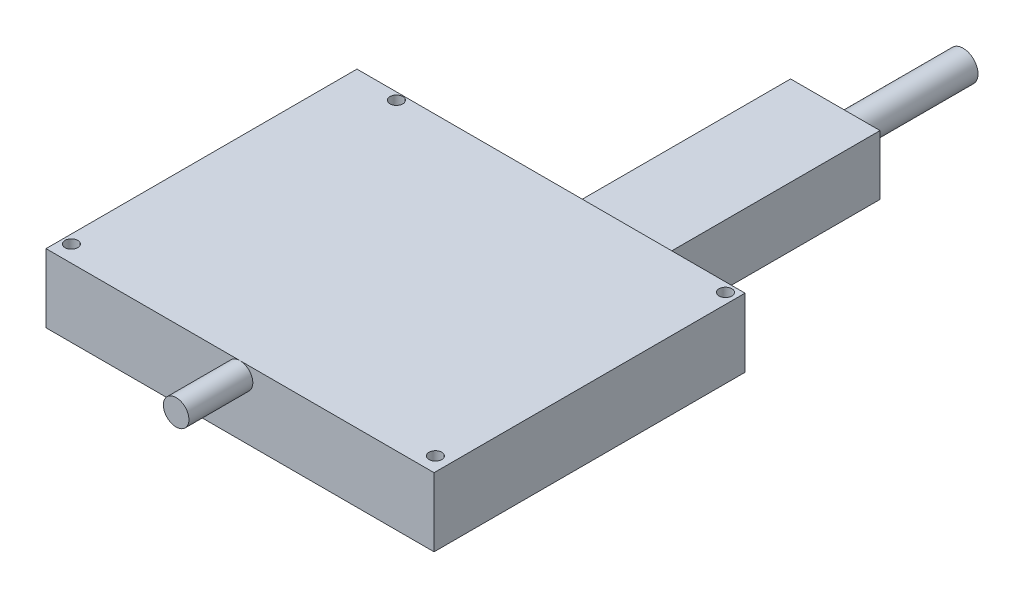
ISO-10303-21;
HEADER;
FILE_DESCRIPTION(('STEP AP214'),'2;1');
FILE_NAME('part.step','',(''),(''),'','','');
FILE_SCHEMA(('AUTOMOTIVE_DESIGN { 1 0 10303 214 1 1 1 1 }'));
ENDSEC;
DATA;
#1=APPLICATION_CONTEXT('core data for automotive mechanical design processes');
#2=APPLICATION_PROTOCOL_DEFINITION('international standard','automotive_design',2000,#1);
#3=PRODUCT_CONTEXT('',#1,'mechanical');
#4=PRODUCT('Part','Part','',(#3));
#5=PRODUCT_RELATED_PRODUCT_CATEGORY('part','',(#4));
#6=PRODUCT_DEFINITION_FORMATION('','',#4);
#7=PRODUCT_DEFINITION_CONTEXT('part definition',#1,'design');
#8=PRODUCT_DEFINITION('design','',#6,#7);
#9=PRODUCT_DEFINITION_SHAPE('','',#8);
#10=(LENGTH_UNIT() NAMED_UNIT(*) SI_UNIT(.MILLI.,.METRE.));
#11=(NAMED_UNIT(*) PLANE_ANGLE_UNIT() SI_UNIT($,.RADIAN.));
#12=(NAMED_UNIT(*) SI_UNIT($,.STERADIAN.) SOLID_ANGLE_UNIT());
#13=UNCERTAINTY_MEASURE_WITH_UNIT(LENGTH_MEASURE(1.E-05),#10,'distance_accuracy_value','');
#14=(GEOMETRIC_REPRESENTATION_CONTEXT(3) GLOBAL_UNCERTAINTY_ASSIGNED_CONTEXT((#13)) GLOBAL_UNIT_ASSIGNED_CONTEXT((#10,
#11,#12)) REPRESENTATION_CONTEXT('',''));
#15=CARTESIAN_POINT('',(0.,0.,0.));
#16=DIRECTION('',(0.,0.,1.));
#17=DIRECTION('',(1.,0.,0.));
#18=AXIS2_PLACEMENT_3D('',#15,#16,#17);
#19=CARTESIAN_POINT('',(0.,16.1,0.));
#20=DIRECTION('',(0.,1.,0.));
#21=DIRECTION('',(0.,0.,1.));
#22=AXIS2_PLACEMENT_3D('',#19,#20,#21);
#23=PLANE('',#22);
#24=CARTESIAN_POINT('',(42.3,16.1,32.93));
#25=DIRECTION('',(0.,1.,0.));
#26=DIRECTION('',(0.,0.,1.));
#27=AXIS2_PLACEMENT_3D('',#24,#25,#26);
#28=CIRCLE('',#27,1.5);
#29=CARTESIAN_POINT('',(42.3,16.1,34.43));
#30=VERTEX_POINT('',#29);
#31=EDGE_CURVE('E188',#30,#30,#28,.T.);
#32=ORIENTED_EDGE('',*,*,#31,.F.);
#33=EDGE_LOOP('',(#32));
#34=FACE_BOUND('',#33,.T.);
#35=CARTESIAN_POINT('',(-34.59,16.1,-34.8));
#36=DIRECTION('',(0.,1.,0.));
#37=DIRECTION('',(0.,0.,1.));
#38=AXIS2_PLACEMENT_3D('',#35,#36,#37);
#39=CIRCLE('',#38,1.5);
#40=CARTESIAN_POINT('',(-34.59,16.1,-33.3));
#41=VERTEX_POINT('',#40);
#42=EDGE_CURVE('E204',#41,#41,#39,.T.);
#43=ORIENTED_EDGE('',*,*,#42,.F.);
#44=EDGE_LOOP('',(#43));
#45=FACE_BOUND('',#44,.T.);
#46=DIRECTION('',(0.,0.,-1.));
#47=VECTOR('',#46,1.);
#48=CARTESIAN_POINT('',(45.55,16.1,-36.5));
#49=LINE('',#48,#47);
#50=CARTESIAN_POINT('',(45.55,16.1,36.5));
#51=VERTEX_POINT('',#50);
#52=CARTESIAN_POINT('',(45.55,16.1,-36.5));
#53=VERTEX_POINT('',#52);
#54=EDGE_CURVE('E212',#51,#53,#49,.T.);
#55=ORIENTED_EDGE('',*,*,#54,.T.);
#56=DIRECTION('',(-1.,0.,0.));
#57=VECTOR('',#56,1.);
#58=CARTESIAN_POINT('',(-45.55,16.1,-36.5));
#59=LINE('',#58,#57);
#60=CARTESIAN_POINT('',(-45.55,16.1,-36.5));
#61=VERTEX_POINT('',#60);
#62=EDGE_CURVE('E216',#53,#61,#59,.T.);
#63=ORIENTED_EDGE('',*,*,#62,.T.);
#64=DIRECTION('',(0.,0.,1.));
#65=VECTOR('',#64,1.);
#66=CARTESIAN_POINT('',(-45.55,16.1,-36.5));
#67=LINE('',#66,#65);
#68=CARTESIAN_POINT('',(-45.55,16.1,36.5));
#69=VERTEX_POINT('',#68);
#70=EDGE_CURVE('E220',#61,#69,#67,.T.);
#71=ORIENTED_EDGE('',*,*,#70,.T.);
#72=DIRECTION('',(1.,0.,0.));
#73=VECTOR('',#72,1.);
#74=CARTESIAN_POINT('',(-45.55,16.1,36.5));
#75=LINE('',#74,#73);
#76=CARTESIAN_POINT('',(0.,16.1,36.5));
#77=VERTEX_POINT('',#76);
#78=EDGE_CURVE('E224',#69,#77,#75,.T.);
#79=ORIENTED_EDGE('',*,*,#78,.T.);
#80=EDGE_CURVE('E223',#77,#51,#75,.T.);
#81=ORIENTED_EDGE('',*,*,#80,.T.);
#82=EDGE_LOOP('',(#55,#63,#71,#79,#81));
#83=FACE_BOUND('',#82,.T.);
#84=CARTESIAN_POINT('',(43.1,16.1,-34.36));
#85=DIRECTION('',(0.,1.,0.));
#86=DIRECTION('',(0.,0.,1.));
#87=AXIS2_PLACEMENT_3D('',#84,#85,#86);
#88=CIRCLE('',#87,1.5);
#89=CARTESIAN_POINT('',(43.1,16.1,-32.86));
#90=VERTEX_POINT('',#89);
#91=EDGE_CURVE('E196',#90,#90,#88,.T.);
#92=ORIENTED_EDGE('',*,*,#91,.F.);
#93=EDGE_LOOP('',(#92));
#94=FACE_BOUND('',#93,.T.);
#95=CARTESIAN_POINT('',(-43.5,16.1,32.58));
#96=DIRECTION('',(0.,1.,0.));
#97=DIRECTION('',(0.,0.,1.));
#98=AXIS2_PLACEMENT_3D('',#95,#96,#97);
#99=CIRCLE('',#98,1.5);
#100=CARTESIAN_POINT('',(-43.5,16.1,34.08));
#101=VERTEX_POINT('',#100);
#102=EDGE_CURVE('E180',#101,#101,#99,.T.);
#103=ORIENTED_EDGE('',*,*,#102,.F.);
#104=EDGE_LOOP('',(#103));
#105=FACE_BOUND('',#104,.T.);
#106=ADVANCED_FACE('F39',(#34,#45,#83,#94,#105),#23,.T.);
#107=CARTESIAN_POINT('',(0.,0.,0.));
#108=DIRECTION('',(0.,1.,0.));
#109=DIRECTION('',(0.,0.,1.));
#110=AXIS2_PLACEMENT_3D('',#107,#108,#109);
#111=PLANE('',#110);
#112=DIRECTION('',(0.,0.,-1.));
#113=VECTOR('',#112,1.);
#114=CARTESIAN_POINT('',(45.55,0.,-36.5));
#115=LINE('',#114,#113);
#116=CARTESIAN_POINT('',(45.55,0.,36.5));
#117=VERTEX_POINT('',#116);
#118=CARTESIAN_POINT('',(45.55,0.,-36.5));
#119=VERTEX_POINT('',#118);
#120=EDGE_CURVE('E208',#117,#119,#115,.T.);
#121=ORIENTED_EDGE('',*,*,#120,.F.);
#122=DIRECTION('',(1.,0.,0.));
#123=VECTOR('',#122,1.);
#124=CARTESIAN_POINT('',(-45.55,0.,36.5));
#125=LINE('',#124,#123);
#126=CARTESIAN_POINT('',(-45.55,0.,36.5));
#127=VERTEX_POINT('',#126);
#128=EDGE_CURVE('E217',#127,#117,#125,.T.);
#129=ORIENTED_EDGE('',*,*,#128,.F.);
#130=DIRECTION('',(0.,0.,1.));
#131=VECTOR('',#130,1.);
#132=CARTESIAN_POINT('',(-45.55,0.,-36.5));
#133=LINE('',#132,#131);
#134=CARTESIAN_POINT('',(-45.55,0.,-36.5));
#135=VERTEX_POINT('',#134);
#136=EDGE_CURVE('E235',#135,#127,#133,.T.);
#137=ORIENTED_EDGE('',*,*,#136,.F.);
#138=DIRECTION('',(-1.,0.,0.));
#139=VECTOR('',#138,1.);
#140=CARTESIAN_POINT('',(-45.55,0.,-36.5));
#141=LINE('',#140,#139);
#142=CARTESIAN_POINT('',(3.24999999999999,0.,-36.5));
#143=VERTEX_POINT('',#142);
#144=EDGE_CURVE('E231',#143,#135,#141,.T.);
#145=ORIENTED_EDGE('',*,*,#144,.F.);
#146=CARTESIAN_POINT('',(24.25,0.,-36.5));
#147=VERTEX_POINT('',#146);
#148=EDGE_CURVE('E236',#147,#143,#141,.T.);
#149=ORIENTED_EDGE('',*,*,#148,.F.);
#150=EDGE_CURVE('E232',#119,#147,#141,.T.);
#151=ORIENTED_EDGE('',*,*,#150,.F.);
#152=EDGE_LOOP('',(#121,#129,#137,#145,#149,#151));
#153=FACE_BOUND('',#152,.T.);
#154=CARTESIAN_POINT('',(-34.59,0.,-34.8));
#155=DIRECTION('',(0.,1.,0.));
#156=DIRECTION('',(0.,0.,1.));
#157=AXIS2_PLACEMENT_3D('',#154,#155,#156);
#158=CIRCLE('',#157,1.5);
#159=CARTESIAN_POINT('',(-34.59,0.,-33.3));
#160=VERTEX_POINT('',#159);
#161=EDGE_CURVE('E200',#160,#160,#158,.T.);
#162=ORIENTED_EDGE('',*,*,#161,.T.);
#163=EDGE_LOOP('',(#162));
#164=FACE_BOUND('',#163,.T.);
#165=CARTESIAN_POINT('',(43.1,0.,-34.36));
#166=DIRECTION('',(0.,1.,0.));
#167=DIRECTION('',(0.,0.,1.));
#168=AXIS2_PLACEMENT_3D('',#165,#166,#167);
#169=CIRCLE('',#168,1.5);
#170=CARTESIAN_POINT('',(43.1,0.,-32.86));
#171=VERTEX_POINT('',#170);
#172=EDGE_CURVE('E192',#171,#171,#169,.T.);
#173=ORIENTED_EDGE('',*,*,#172,.T.);
#174=EDGE_LOOP('',(#173));
#175=FACE_BOUND('',#174,.T.);
#176=CARTESIAN_POINT('',(42.3,0.,32.93));
#177=DIRECTION('',(0.,1.,0.));
#178=DIRECTION('',(0.,0.,1.));
#179=AXIS2_PLACEMENT_3D('',#176,#177,#178);
#180=CIRCLE('',#179,1.5);
#181=CARTESIAN_POINT('',(42.3,0.,34.43));
#182=VERTEX_POINT('',#181);
#183=EDGE_CURVE('E184',#182,#182,#180,.T.);
#184=ORIENTED_EDGE('',*,*,#183,.T.);
#185=EDGE_LOOP('',(#184));
#186=FACE_BOUND('',#185,.T.);
#187=CARTESIAN_POINT('',(-43.5,0.,32.58));
#188=DIRECTION('',(0.,1.,0.));
#189=DIRECTION('',(0.,0.,1.));
#190=AXIS2_PLACEMENT_3D('',#187,#188,#189);
#191=CIRCLE('',#190,1.5);
#192=CARTESIAN_POINT('',(-43.5,0.,34.08));
#193=VERTEX_POINT('',#192);
#194=EDGE_CURVE('E176',#193,#193,#191,.T.);
#195=ORIENTED_EDGE('',*,*,#194,.T.);
#196=EDGE_LOOP('',(#195));
#197=FACE_BOUND('',#196,.T.);
#198=ADVANCED_FACE('F263',(#153,#164,#175,#186,#197),#111,.F.);
#199=CARTESIAN_POINT('',(45.55,16.1,-36.5));
#200=DIRECTION('',(-1.,0.,0.));
#201=DIRECTION('',(0.,0.,1.));
#202=AXIS2_PLACEMENT_3D('',#199,#200,#201);
#203=PLANE('',#202);
#204=ORIENTED_EDGE('',*,*,#120,.T.);
#205=DIRECTION('',(0.,-1.,0.));
#206=VECTOR('',#205,1.);
#207=CARTESIAN_POINT('',(45.55,16.1,-36.5));
#208=LINE('',#207,#206);
#209=EDGE_CURVE('E43',#53,#119,#208,.T.);
#210=ORIENTED_EDGE('',*,*,#209,.F.);
#211=ORIENTED_EDGE('',*,*,#54,.F.);
#212=DIRECTION('',(0.,-1.,0.));
#213=VECTOR('',#212,1.);
#214=CARTESIAN_POINT('',(45.55,16.1,36.5));
#215=LINE('',#214,#213);
#216=EDGE_CURVE('E227',#51,#117,#215,.T.);
#217=ORIENTED_EDGE('',*,*,#216,.T.);
#218=EDGE_LOOP('',(#204,#210,#211,#217));
#219=FACE_BOUND('',#218,.T.);
#220=ADVANCED_FACE('F41',(#219),#203,.F.);
#221=CARTESIAN_POINT('',(-45.55,16.1,-36.5));
#222=DIRECTION('',(0.,0.,1.));
#223=DIRECTION('',(1.,0.,0.));
#224=AXIS2_PLACEMENT_3D('',#221,#222,#223);
#225=PLANE('',#224);
#226=ORIENTED_EDGE('',*,*,#150,.T.);
#227=DIRECTION('',(0.,1.,0.));
#228=VECTOR('',#227,1.);
#229=CARTESIAN_POINT('',(24.25,-2.,-36.5));
#230=LINE('',#229,#228);
#231=CARTESIAN_POINT('',(24.25,12.,-36.5));
#232=VERTEX_POINT('',#231);
#233=EDGE_CURVE('E49',#147,#232,#230,.T.);
#234=ORIENTED_EDGE('',*,*,#233,.T.);
#235=DIRECTION('',(1.,0.,0.));
#236=VECTOR('',#235,1.);
#237=CARTESIAN_POINT('',(3.25,12.,-36.5));
#238=LINE('',#237,#236);
#239=CARTESIAN_POINT('',(3.25,12.,-36.5));
#240=VERTEX_POINT('',#239);
#241=EDGE_CURVE('E112',#240,#232,#238,.T.);
#242=ORIENTED_EDGE('',*,*,#241,.F.);
#243=DIRECTION('',(0.,1.,0.));
#244=VECTOR('',#243,1.);
#245=CARTESIAN_POINT('',(3.25,-2.,-36.5));
#246=LINE('',#245,#244);
#247=EDGE_CURVE('E62',#143,#240,#246,.T.);
#248=ORIENTED_EDGE('',*,*,#247,.F.);
#249=ORIENTED_EDGE('',*,*,#144,.T.);
#250=DIRECTION('',(0.,-1.,0.));
#251=VECTOR('',#250,1.);
#252=CARTESIAN_POINT('',(-45.55,16.1,-36.5));
#253=LINE('',#252,#251);
#254=EDGE_CURVE('E247',#61,#135,#253,.T.);
#255=ORIENTED_EDGE('',*,*,#254,.F.);
#256=ORIENTED_EDGE('',*,*,#62,.F.);
#257=ORIENTED_EDGE('',*,*,#209,.T.);
#258=EDGE_LOOP('',(#226,#234,#242,#248,#249,#255,#256,#257));
#259=FACE_BOUND('',#258,.T.);
#260=ADVANCED_FACE('F113',(#259),#225,.F.);
#261=CARTESIAN_POINT('',(-45.55,16.1,-36.5));
#262=DIRECTION('',(1.,0.,0.));
#263=DIRECTION('',(0.,0.,-1.));
#264=AXIS2_PLACEMENT_3D('',#261,#262,#263);
#265=PLANE('',#264);
#266=ORIENTED_EDGE('',*,*,#136,.T.);
#267=DIRECTION('',(0.,-1.,0.));
#268=VECTOR('',#267,1.);
#269=CARTESIAN_POINT('',(-45.55,16.1,36.5));
#270=LINE('',#269,#268);
#271=EDGE_CURVE('E244',#69,#127,#270,.T.);
#272=ORIENTED_EDGE('',*,*,#271,.F.);
#273=ORIENTED_EDGE('',*,*,#70,.F.);
#274=ORIENTED_EDGE('',*,*,#254,.T.);
#275=EDGE_LOOP('',(#266,#272,#273,#274));
#276=FACE_BOUND('',#275,.T.);
#277=ADVANCED_FACE('F270',(#276),#265,.F.);
#278=CARTESIAN_POINT('',(-45.55,16.1,36.5));
#279=DIRECTION('',(0.,0.,-1.));
#280=DIRECTION('',(-1.,0.,0.));
#281=AXIS2_PLACEMENT_3D('',#278,#279,#280);
#282=PLANE('',#281);
#283=ORIENTED_EDGE('',*,*,#80,.F.);
#284=CARTESIAN_POINT('',(0.,13.1,36.5));
#285=DIRECTION('',(0.,0.,1.));
#286=DIRECTION('',(1.,0.,0.));
#287=AXIS2_PLACEMENT_3D('',#284,#285,#286);
#288=CIRCLE('',#287,3.);
#289=EDGE_CURVE('E163',#77,#77,#288,.T.);
#290=ORIENTED_EDGE('',*,*,#289,.F.);
#291=ORIENTED_EDGE('',*,*,#78,.F.);
#292=ORIENTED_EDGE('',*,*,#271,.T.);
#293=ORIENTED_EDGE('',*,*,#128,.T.);
#294=ORIENTED_EDGE('',*,*,#216,.F.);
#295=EDGE_LOOP('',(#283,#290,#291,#292,#293,#294));
#296=FACE_BOUND('',#295,.T.);
#297=ADVANCED_FACE('F278',(#296),#282,.F.);
#298=CARTESIAN_POINT('',(-34.59,16.1,-34.8));
#299=DIRECTION('',(0.,-1.,0.));
#300=DIRECTION('',(0.,0.,-1.));
#301=AXIS2_PLACEMENT_3D('',#298,#299,#300);
#302=CYLINDRICAL_SURFACE('',#301,1.5);
#303=ORIENTED_EDGE('',*,*,#42,.T.);
#304=EDGE_LOOP('',(#303));
#305=FACE_BOUND('',#304,.T.);
#306=ORIENTED_EDGE('',*,*,#161,.F.);
#307=EDGE_LOOP('',(#306));
#308=FACE_BOUND('',#307,.T.);
#309=ADVANCED_FACE('F306',(#305,#308),#302,.F.);
#310=CARTESIAN_POINT('',(43.1,16.1,-34.36));
#311=DIRECTION('',(0.,-1.,0.));
#312=DIRECTION('',(0.,0.,-1.));
#313=AXIS2_PLACEMENT_3D('',#310,#311,#312);
#314=CYLINDRICAL_SURFACE('',#313,1.5);
#315=ORIENTED_EDGE('',*,*,#91,.T.);
#316=EDGE_LOOP('',(#315));
#317=FACE_BOUND('',#316,.T.);
#318=ORIENTED_EDGE('',*,*,#172,.F.);
#319=EDGE_LOOP('',(#318));
#320=FACE_BOUND('',#319,.T.);
#321=ADVANCED_FACE('F439',(#317,#320),#314,.F.);
#322=CARTESIAN_POINT('',(42.3,16.1,32.93));
#323=DIRECTION('',(0.,-1.,0.));
#324=DIRECTION('',(0.,0.,-1.));
#325=AXIS2_PLACEMENT_3D('',#322,#323,#324);
#326=CYLINDRICAL_SURFACE('',#325,1.5);
#327=ORIENTED_EDGE('',*,*,#31,.T.);
#328=EDGE_LOOP('',(#327));
#329=FACE_BOUND('',#328,.T.);
#330=ORIENTED_EDGE('',*,*,#183,.F.);
#331=EDGE_LOOP('',(#330));
#332=FACE_BOUND('',#331,.T.);
#333=ADVANCED_FACE('F292',(#329,#332),#326,.F.);
#334=CARTESIAN_POINT('',(-43.5,16.1,32.58));
#335=DIRECTION('',(0.,-1.,0.));
#336=DIRECTION('',(0.,0.,-1.));
#337=AXIS2_PLACEMENT_3D('',#334,#335,#336);
#338=CYLINDRICAL_SURFACE('',#337,1.5);
#339=ORIENTED_EDGE('',*,*,#102,.T.);
#340=EDGE_LOOP('',(#339));
#341=FACE_BOUND('',#340,.T.);
#342=ORIENTED_EDGE('',*,*,#194,.F.);
#343=EDGE_LOOP('',(#342));
#344=FACE_BOUND('',#343,.T.);
#345=ADVANCED_FACE('F283',(#341,#344),#338,.F.);
#346=CARTESIAN_POINT('',(0.,13.1,51.5));
#347=DIRECTION('',(0.,0.,-1.));
#348=DIRECTION('',(-1.,0.,0.));
#349=AXIS2_PLACEMENT_3D('',#346,#347,#348);
#350=CYLINDRICAL_SURFACE('',#349,3.);
#351=CARTESIAN_POINT('',(0.,13.1,51.5));
#352=DIRECTION('',(0.,0.,1.));
#353=DIRECTION('',(1.,0.,0.));
#354=AXIS2_PLACEMENT_3D('',#351,#352,#353);
#355=CIRCLE('',#354,3.);
#356=CARTESIAN_POINT('',(3.,13.1,51.5));
#357=VERTEX_POINT('',#356);
#358=EDGE_CURVE('E172',#357,#357,#355,.T.);
#359=ORIENTED_EDGE('',*,*,#358,.F.);
#360=EDGE_LOOP('',(#359));
#361=FACE_BOUND('',#360,.T.);
#362=ORIENTED_EDGE('',*,*,#289,.T.);
#363=EDGE_LOOP('',(#362));
#364=FACE_BOUND('',#363,.T.);
#365=ADVANCED_FACE('F280',(#361,#364),#350,.T.);
#366=CARTESIAN_POINT('',(0.,13.1,51.5));
#367=DIRECTION('',(0.,0.,1.));
#368=DIRECTION('',(1.,0.,0.));
#369=AXIS2_PLACEMENT_3D('',#366,#367,#368);
#370=PLANE('',#369);
#371=ORIENTED_EDGE('',*,*,#358,.T.);
#372=EDGE_LOOP('',(#371));
#373=FACE_BOUND('',#372,.T.);
#374=ADVANCED_FACE('F282',(#373),#370,.T.);
#375=CARTESIAN_POINT('',(3.25,-2.,-36.5));
#376=DIRECTION('',(-1.,0.,0.));
#377=DIRECTION('',(0.,0.,1.));
#378=AXIS2_PLACEMENT_3D('',#375,#376,#377);
#379=PLANE('',#378);
#380=CARTESIAN_POINT('',(3.25,-2.,-36.5));
#381=VERTEX_POINT('',#380);
#382=EDGE_CURVE('E127',#381,#143,#246,.T.);
#383=ORIENTED_EDGE('',*,*,#382,.T.);
#384=ORIENTED_EDGE('',*,*,#247,.T.);
#385=DIRECTION('',(0.,0.,1.));
#386=VECTOR('',#385,1.);
#387=CARTESIAN_POINT('',(3.25,12.,-36.5));
#388=LINE('',#387,#386);
#389=CARTESIAN_POINT('',(3.25000000000001,12.,-89.5));
#390=VERTEX_POINT('',#389);
#391=EDGE_CURVE('E120',#390,#240,#388,.T.);
#392=ORIENTED_EDGE('',*,*,#391,.F.);
#393=DIRECTION('',(0.,1.,0.));
#394=VECTOR('',#393,1.);
#395=CARTESIAN_POINT('',(3.25000000000001,-2.,-89.5));
#396=LINE('',#395,#394);
#397=CARTESIAN_POINT('',(3.25000000000001,-2.,-89.5));
#398=VERTEX_POINT('',#397);
#399=EDGE_CURVE('E160',#398,#390,#396,.T.);
#400=ORIENTED_EDGE('',*,*,#399,.F.);
#401=DIRECTION('',(0.,0.,1.));
#402=VECTOR('',#401,1.);
#403=CARTESIAN_POINT('',(3.25,-2.,-36.5));
#404=LINE('',#403,#402);
#405=EDGE_CURVE('E145',#398,#381,#404,.T.);
#406=ORIENTED_EDGE('',*,*,#405,.T.);
#407=EDGE_LOOP('',(#383,#384,#392,#400,#406));
#408=FACE_BOUND('',#407,.T.);
#409=ADVANCED_FACE('F125',(#408),#379,.T.);
#410=CARTESIAN_POINT('',(3.25000000000001,-2.,-89.5));
#411=DIRECTION('',(0.,0.,-1.));
#412=DIRECTION('',(-1.,0.,0.));
#413=AXIS2_PLACEMENT_3D('',#410,#411,#412);
#414=PLANE('',#413);
#415=CARTESIAN_POINT('',(13.75,5.,-89.5));
#416=DIRECTION('',(0.,0.,-1.));
#417=DIRECTION('',(-1.,0.,0.));
#418=AXIS2_PLACEMENT_3D('',#415,#416,#417);
#419=CIRCLE('',#418,3.5);
#420=CARTESIAN_POINT('',(10.25,5.,-89.5));
#421=VERTEX_POINT('',#420);
#422=EDGE_CURVE('E11',#421,#421,#419,.T.);
#423=ORIENTED_EDGE('',*,*,#422,.F.);
#424=EDGE_LOOP('',(#423));
#425=FACE_BOUND('',#424,.T.);
#426=ORIENTED_EDGE('',*,*,#399,.T.);
#427=DIRECTION('',(-1.,0.,0.));
#428=VECTOR('',#427,1.);
#429=CARTESIAN_POINT('',(3.25000000000001,12.,-89.5));
#430=LINE('',#429,#428);
#431=CARTESIAN_POINT('',(24.25,12.,-89.5));
#432=VERTEX_POINT('',#431);
#433=EDGE_CURVE('E133',#432,#390,#430,.T.);
#434=ORIENTED_EDGE('',*,*,#433,.F.);
#435=DIRECTION('',(0.,1.,0.));
#436=VECTOR('',#435,1.);
#437=CARTESIAN_POINT('',(24.25,-2.,-89.5));
#438=LINE('',#437,#436);
#439=CARTESIAN_POINT('',(24.25,-2.,-89.5));
#440=VERTEX_POINT('',#439);
#441=EDGE_CURVE('E164',#440,#432,#438,.T.);
#442=ORIENTED_EDGE('',*,*,#441,.F.);
#443=DIRECTION('',(-1.,0.,0.));
#444=VECTOR('',#443,1.);
#445=CARTESIAN_POINT('',(3.25000000000001,-2.,-89.5));
#446=LINE('',#445,#444);
#447=EDGE_CURVE('E156',#440,#398,#446,.T.);
#448=ORIENTED_EDGE('',*,*,#447,.T.);
#449=EDGE_LOOP('',(#426,#434,#442,#448));
#450=FACE_BOUND('',#449,.T.);
#451=ADVANCED_FACE('F341',(#425,#450),#414,.T.);
#452=CARTESIAN_POINT('',(24.25,-2.,-36.5));
#453=DIRECTION('',(1.,0.,0.));
#454=DIRECTION('',(0.,0.,-1.));
#455=AXIS2_PLACEMENT_3D('',#452,#453,#454);
#456=PLANE('',#455);
#457=ORIENTED_EDGE('',*,*,#441,.T.);
#458=DIRECTION('',(0.,0.,-1.));
#459=VECTOR('',#458,1.);
#460=CARTESIAN_POINT('',(24.25,12.,-36.5));
#461=LINE('',#460,#459);
#462=EDGE_CURVE('E119',#232,#432,#461,.T.);
#463=ORIENTED_EDGE('',*,*,#462,.F.);
#464=ORIENTED_EDGE('',*,*,#233,.F.);
#465=CARTESIAN_POINT('',(24.25,-2.,-36.5));
#466=VERTEX_POINT('',#465);
#467=EDGE_CURVE('E167',#466,#147,#230,.T.);
#468=ORIENTED_EDGE('',*,*,#467,.F.);
#469=DIRECTION('',(0.,0.,-1.));
#470=VECTOR('',#469,1.);
#471=CARTESIAN_POINT('',(24.25,-2.,-36.5));
#472=LINE('',#471,#470);
#473=EDGE_CURVE('E152',#466,#440,#472,.T.);
#474=ORIENTED_EDGE('',*,*,#473,.T.);
#475=EDGE_LOOP('',(#457,#463,#464,#468,#474));
#476=FACE_BOUND('',#475,.T.);
#477=ADVANCED_FACE('F348',(#476),#456,.T.);
#478=CARTESIAN_POINT('',(3.25,-2.,-36.5));
#479=DIRECTION('',(0.,0.,1.));
#480=DIRECTION('',(1.,0.,0.));
#481=AXIS2_PLACEMENT_3D('',#478,#479,#480);
#482=PLANE('',#481);
#483=ORIENTED_EDGE('',*,*,#467,.T.);
#484=ORIENTED_EDGE('',*,*,#148,.T.);
#485=ORIENTED_EDGE('',*,*,#382,.F.);
#486=DIRECTION('',(1.,0.,0.));
#487=VECTOR('',#486,1.);
#488=CARTESIAN_POINT('',(3.25,-2.,-36.5));
#489=LINE('',#488,#487);
#490=EDGE_CURVE('E148',#381,#466,#489,.T.);
#491=ORIENTED_EDGE('',*,*,#490,.T.);
#492=EDGE_LOOP('',(#483,#484,#485,#491));
#493=FACE_BOUND('',#492,.T.);
#494=ADVANCED_FACE('F353',(#493),#482,.T.);
#495=CARTESIAN_POINT('',(0.,-2.,0.));
#496=DIRECTION('',(0.,-1.,0.));
#497=DIRECTION('',(0.,0.,-1.));
#498=AXIS2_PLACEMENT_3D('',#495,#496,#497);
#499=PLANE('',#498);
#500=ORIENTED_EDGE('',*,*,#405,.F.);
#501=ORIENTED_EDGE('',*,*,#447,.F.);
#502=ORIENTED_EDGE('',*,*,#473,.F.);
#503=ORIENTED_EDGE('',*,*,#490,.F.);
#504=EDGE_LOOP('',(#500,#501,#502,#503));
#505=FACE_BOUND('',#504,.T.);
#506=ADVANCED_FACE('F363',(#505),#499,.T.);
#507=CARTESIAN_POINT('',(0.,12.,0.));
#508=DIRECTION('',(0.,-1.,0.));
#509=DIRECTION('',(0.,0.,-1.));
#510=AXIS2_PLACEMENT_3D('',#507,#508,#509);
#511=PLANE('',#510);
#512=ORIENTED_EDGE('',*,*,#391,.T.);
#513=ORIENTED_EDGE('',*,*,#241,.T.);
#514=ORIENTED_EDGE('',*,*,#462,.T.);
#515=ORIENTED_EDGE('',*,*,#433,.T.);
#516=EDGE_LOOP('',(#512,#513,#514,#515));
#517=FACE_BOUND('',#516,.T.);
#518=ADVANCED_FACE('F131',(#517),#511,.F.);
#519=CARTESIAN_POINT('',(13.75,5.,-119.5));
#520=DIRECTION('',(0.,0.,1.));
#521=DIRECTION('',(1.,0.,0.));
#522=AXIS2_PLACEMENT_3D('',#519,#520,#521);
#523=CYLINDRICAL_SURFACE('',#522,3.5);
#524=CARTESIAN_POINT('',(13.75,5.,-119.5));
#525=DIRECTION('',(0.,0.,-1.));
#526=DIRECTION('',(-1.,0.,0.));
#527=AXIS2_PLACEMENT_3D('',#524,#525,#526);
#528=CIRCLE('',#527,3.5);
#529=CARTESIAN_POINT('',(10.25,5.,-119.5));
#530=VERTEX_POINT('',#529);
#531=EDGE_CURVE('E135',#530,#530,#528,.T.);
#532=ORIENTED_EDGE('',*,*,#531,.F.);
#533=EDGE_LOOP('',(#532));
#534=FACE_BOUND('',#533,.T.);
#535=ORIENTED_EDGE('',*,*,#422,.T.);
#536=EDGE_LOOP('',(#535));
#537=FACE_BOUND('',#536,.T.);
#538=ADVANCED_FACE('F381',(#534,#537),#523,.T.);
#539=CARTESIAN_POINT('',(13.75,5.,-119.5));
#540=DIRECTION('',(0.,0.,-1.));
#541=DIRECTION('',(-1.,0.,0.));
#542=AXIS2_PLACEMENT_3D('',#539,#540,#541);
#543=PLANE('',#542);
#544=ORIENTED_EDGE('',*,*,#531,.T.);
#545=EDGE_LOOP('',(#544));
#546=FACE_BOUND('',#545,.T.);
#547=ADVANCED_FACE('F397',(#546),#543,.T.);
#548=CLOSED_SHELL('',(#106,#198,#220,#260,#277,#297,#309,#321,#333,#345,#365,#374,#409,#451,
#477,#494,#506,#518,#538,#547));
#549=MANIFOLD_SOLID_BREP('B2',#548);
#550=ADVANCED_BREP_SHAPE_REPRESENTATION('',(#18,#549),#14);
#551=SHAPE_DEFINITION_REPRESENTATION(#9,#550);
ENDSEC;
END-ISO-10303-21;
